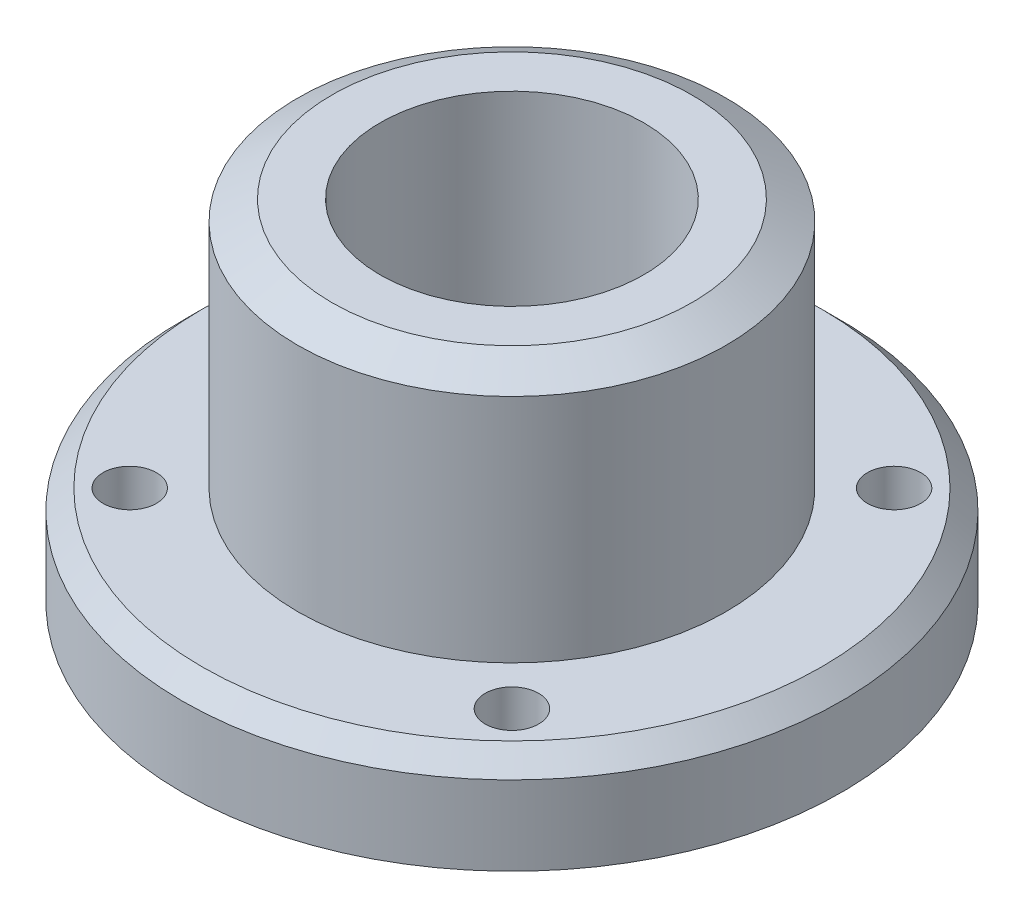
ISO-10303-21;
HEADER;
FILE_DESCRIPTION(('STEP AP214'),'2;1');
FILE_NAME('part.step','',(''),(''),'','','');
FILE_SCHEMA(('AUTOMOTIVE_DESIGN { 1 0 10303 214 1 1 1 1 }'));
ENDSEC;
DATA;
#1=APPLICATION_CONTEXT('core data for automotive mechanical design processes');
#2=APPLICATION_PROTOCOL_DEFINITION('international standard','automotive_design',2000,#1);
#3=PRODUCT_CONTEXT('',#1,'mechanical');
#4=PRODUCT('Part','Part','',(#3));
#5=PRODUCT_RELATED_PRODUCT_CATEGORY('part','',(#4));
#6=PRODUCT_DEFINITION_FORMATION('','',#4);
#7=PRODUCT_DEFINITION_CONTEXT('part definition',#1,'design');
#8=PRODUCT_DEFINITION('design','',#6,#7);
#9=PRODUCT_DEFINITION_SHAPE('','',#8);
#10=(LENGTH_UNIT() NAMED_UNIT(*) SI_UNIT(.MILLI.,.METRE.));
#11=(NAMED_UNIT(*) PLANE_ANGLE_UNIT() SI_UNIT($,.RADIAN.));
#12=(NAMED_UNIT(*) SI_UNIT($,.STERADIAN.) SOLID_ANGLE_UNIT());
#13=UNCERTAINTY_MEASURE_WITH_UNIT(LENGTH_MEASURE(1.E-05),#10,'distance_accuracy_value','');
#14=(GEOMETRIC_REPRESENTATION_CONTEXT(3) GLOBAL_UNCERTAINTY_ASSIGNED_CONTEXT((#13)) GLOBAL_UNIT_ASSIGNED_CONTEXT((#10,
#11,#12)) REPRESENTATION_CONTEXT('',''));
#15=CARTESIAN_POINT('',(0.,0.,0.));
#16=DIRECTION('',(0.,0.,1.));
#17=DIRECTION('',(1.,0.,0.));
#18=AXIS2_PLACEMENT_3D('',#15,#16,#17);
#19=CARTESIAN_POINT('',(0.,26.5,0.));
#20=DIRECTION('',(0.,-1.,0.));
#21=DIRECTION('',(0.,0.,-1.));
#22=AXIS2_PLACEMENT_3D('',#19,#20,#21);
#23=CYLINDRICAL_SURFACE('',#22,50.);
#24=CARTESIAN_POINT('',(0.,23.5,0.));
#25=DIRECTION('',(0.,1.,0.));
#26=DIRECTION('',(0.,0.,1.));
#27=AXIS2_PLACEMENT_3D('',#24,#25,#26);
#28=CIRCLE('',#27,50.);
#29=CARTESIAN_POINT('',(0.,23.5,50.));
#30=VERTEX_POINT('',#29);
#31=EDGE_CURVE('E51',#30,#30,#28,.F.);
#32=ORIENTED_EDGE('',*,*,#31,.T.);
#33=EDGE_LOOP('',(#32));
#34=FACE_BOUND('',#33,.T.);
#35=CARTESIAN_POINT('',(0.,11.5,0.));
#36=DIRECTION('',(0.,-1.,0.));
#37=DIRECTION('',(0.,0.,1.));
#38=AXIS2_PLACEMENT_3D('',#35,#36,#37);
#39=CIRCLE('',#38,50.);
#40=CARTESIAN_POINT('',(0.,11.5,50.));
#41=VERTEX_POINT('',#40);
#42=EDGE_CURVE('E59',#41,#41,#39,.T.);
#43=ORIENTED_EDGE('',*,*,#42,.F.);
#44=EDGE_LOOP('',(#43));
#45=FACE_BOUND('',#44,.T.);
#46=ADVANCED_FACE('F43',(#34,#45),#23,.T.);
#47=CARTESIAN_POINT('',(0.,26.5,0.));
#48=DIRECTION('',(0.,1.,0.));
#49=DIRECTION('',(0.,0.,1.));
#50=AXIS2_PLACEMENT_3D('',#47,#48,#49);
#51=PLANE('',#50);
#52=CARTESIAN_POINT('',(0.,26.5,0.));
#53=DIRECTION('',(0.,1.,0.));
#54=DIRECTION('',(0.,0.,1.));
#55=AXIS2_PLACEMENT_3D('',#52,#53,#54);
#56=CIRCLE('',#55,47.);
#57=CARTESIAN_POINT('',(0.,26.5,47.));
#58=VERTEX_POINT('',#57);
#59=EDGE_CURVE('E10',#58,#58,#56,.T.);
#60=ORIENTED_EDGE('',*,*,#59,.T.);
#61=EDGE_LOOP('',(#60));
#62=FACE_BOUND('',#61,.T.);
#63=CARTESIAN_POINT('',(-28.9913780286485,26.5,-28.9913780286485));
#64=DIRECTION('',(0.,1.,0.));
#65=DIRECTION('',(0.,0.,1.));
#66=AXIS2_PLACEMENT_3D('',#63,#64,#65);
#67=CIRCLE('',#66,4.05000000000002);
#68=CARTESIAN_POINT('',(-28.9913780286485,26.5,-24.9413780286485));
#69=VERTEX_POINT('',#68);
#70=EDGE_CURVE('E88',#69,#69,#67,.F.);
#71=ORIENTED_EDGE('',*,*,#70,.T.);
#72=EDGE_LOOP('',(#71));
#73=FACE_BOUND('',#72,.T.);
#74=CARTESIAN_POINT('',(-28.9913780286486,26.5,28.9913780286484));
#75=DIRECTION('',(0.,1.,0.));
#76=DIRECTION('',(0.,0.,1.));
#77=AXIS2_PLACEMENT_3D('',#74,#75,#76);
#78=CIRCLE('',#77,4.05000000000002);
#79=CARTESIAN_POINT('',(-28.9913780286486,26.5,33.0413780286485));
#80=VERTEX_POINT('',#79);
#81=EDGE_CURVE('E91',#80,#80,#78,.F.);
#82=ORIENTED_EDGE('',*,*,#81,.T.);
#83=EDGE_LOOP('',(#82));
#84=FACE_BOUND('',#83,.T.);
#85=CARTESIAN_POINT('',(28.9913780286487,26.5,28.9913780286483));
#86=DIRECTION('',(0.,1.,0.));
#87=DIRECTION('',(0.,0.,1.));
#88=AXIS2_PLACEMENT_3D('',#85,#86,#87);
#89=CIRCLE('',#88,4.05000000000002);
#90=CARTESIAN_POINT('',(28.9913780286487,26.5,33.0413780286483));
#91=VERTEX_POINT('',#90);
#92=EDGE_CURVE('E94',#91,#91,#89,.F.);
#93=ORIENTED_EDGE('',*,*,#92,.T.);
#94=EDGE_LOOP('',(#93));
#95=FACE_BOUND('',#94,.T.);
#96=CARTESIAN_POINT('',(28.9913780286486,26.5,-28.9913780286484));
#97=DIRECTION('',(0.,1.,0.));
#98=DIRECTION('',(0.,0.,1.));
#99=AXIS2_PLACEMENT_3D('',#96,#97,#98);
#100=CIRCLE('',#99,4.05000000000002);
#101=CARTESIAN_POINT('',(28.9913780286486,26.5,-24.9413780286484));
#102=VERTEX_POINT('',#101);
#103=EDGE_CURVE('E80',#102,#102,#100,.F.);
#104=ORIENTED_EDGE('',*,*,#103,.T.);
#105=EDGE_LOOP('',(#104));
#106=FACE_BOUND('',#105,.T.);
#107=CARTESIAN_POINT('',(0.,26.5,0.));
#108=DIRECTION('',(0.,1.,0.));
#109=DIRECTION('',(0.,0.,1.));
#110=AXIS2_PLACEMENT_3D('',#107,#108,#109);
#111=CIRCLE('',#110,32.5);
#112=CARTESIAN_POINT('',(0.,26.5,32.5));
#113=VERTEX_POINT('',#112);
#114=EDGE_CURVE('E55',#113,#113,#111,.T.);
#115=ORIENTED_EDGE('',*,*,#114,.F.);
#116=EDGE_LOOP('',(#115));
#117=FACE_BOUND('',#116,.T.);
#118=ADVANCED_FACE('F125',(#62,#73,#84,#95,#106,#117),#51,.T.);
#119=CARTESIAN_POINT('',(0.,11.5,0.));
#120=DIRECTION('',(0.,1.,0.));
#121=DIRECTION('',(0.,0.,1.));
#122=AXIS2_PLACEMENT_3D('',#119,#120,#121);
#123=PLANE('',#122);
#124=CARTESIAN_POINT('',(-28.9913780286485,11.5,-28.9913780286485));
#125=DIRECTION('',(0.,1.,0.));
#126=DIRECTION('',(1.,0.,0.));
#127=AXIS2_PLACEMENT_3D('',#124,#125,#126);
#128=CIRCLE('',#127,4.05000000000002);
#129=CARTESIAN_POINT('',(-24.9413780286485,11.5,-28.9913780286485));
#130=VERTEX_POINT('',#129);
#131=EDGE_CURVE('E97',#130,#130,#128,.T.);
#132=ORIENTED_EDGE('',*,*,#131,.T.);
#133=EDGE_LOOP('',(#132));
#134=FACE_BOUND('',#133,.T.);
#135=CARTESIAN_POINT('',(-28.9913780286486,11.5,28.9913780286484));
#136=DIRECTION('',(0.,1.,0.));
#137=DIRECTION('',(0.,0.,-1.));
#138=AXIS2_PLACEMENT_3D('',#135,#136,#137);
#139=CIRCLE('',#138,4.05000000000002);
#140=CARTESIAN_POINT('',(-28.9913780286486,11.5,24.9413780286484));
#141=VERTEX_POINT('',#140);
#142=EDGE_CURVE('E101',#141,#141,#139,.T.);
#143=ORIENTED_EDGE('',*,*,#142,.T.);
#144=EDGE_LOOP('',(#143));
#145=FACE_BOUND('',#144,.T.);
#146=CARTESIAN_POINT('',(28.9913780286487,11.5,28.9913780286483));
#147=DIRECTION('',(0.,1.,0.));
#148=DIRECTION('',(-1.,0.,0.));
#149=AXIS2_PLACEMENT_3D('',#146,#147,#148);
#150=CIRCLE('',#149,4.05000000000002);
#151=CARTESIAN_POINT('',(24.9413780286487,11.5,28.9913780286483));
#152=VERTEX_POINT('',#151);
#153=EDGE_CURVE('E98',#152,#152,#150,.T.);
#154=ORIENTED_EDGE('',*,*,#153,.T.);
#155=EDGE_LOOP('',(#154));
#156=FACE_BOUND('',#155,.T.);
#157=CARTESIAN_POINT('',(28.9913780286486,11.5,-28.9913780286484));
#158=DIRECTION('',(0.,1.,0.));
#159=DIRECTION('',(0.,0.,1.));
#160=AXIS2_PLACEMENT_3D('',#157,#158,#159);
#161=CIRCLE('',#160,4.05000000000002);
#162=CARTESIAN_POINT('',(28.9913780286486,11.5,-24.9413780286484));
#163=VERTEX_POINT('',#162);
#164=EDGE_CURVE('E85',#163,#163,#161,.T.);
#165=ORIENTED_EDGE('',*,*,#164,.T.);
#166=EDGE_LOOP('',(#165));
#167=FACE_BOUND('',#166,.T.);
#168=CARTESIAN_POINT('',(0.,11.5,0.));
#169=DIRECTION('',(0.,-1.,0.));
#170=DIRECTION('',(0.,0.,1.));
#171=AXIS2_PLACEMENT_3D('',#168,#169,#170);
#172=CIRCLE('',#171,25.75);
#173=CARTESIAN_POINT('',(0.,11.5,25.75));
#174=VERTEX_POINT('',#173);
#175=EDGE_CURVE('E71',#174,#174,#172,.T.);
#176=ORIENTED_EDGE('',*,*,#175,.F.);
#177=EDGE_LOOP('',(#176));
#178=FACE_BOUND('',#177,.T.);
#179=ORIENTED_EDGE('',*,*,#42,.T.);
#180=EDGE_LOOP('',(#179));
#181=FACE_BOUND('',#180,.T.);
#182=ADVANCED_FACE('F107',(#134,#145,#156,#167,#178,#181),#123,.F.);
#183=CARTESIAN_POINT('',(0.,61.5,0.));
#184=DIRECTION('',(0.,-1.,0.));
#185=DIRECTION('',(0.,0.,-1.));
#186=AXIS2_PLACEMENT_3D('',#183,#184,#185);
#187=CYLINDRICAL_SURFACE('',#186,32.5);
#188=CARTESIAN_POINT('',(0.,61.5,0.));
#189=DIRECTION('',(0.,1.,0.));
#190=DIRECTION('',(0.,0.,1.));
#191=AXIS2_PLACEMENT_3D('',#188,#189,#190);
#192=CIRCLE('',#191,32.5);
#193=CARTESIAN_POINT('',(0.,61.5,32.5));
#194=VERTEX_POINT('',#193);
#195=EDGE_CURVE('E63',#194,#194,#192,.T.);
#196=ORIENTED_EDGE('',*,*,#195,.F.);
#197=EDGE_LOOP('',(#196));
#198=FACE_BOUND('',#197,.T.);
#199=ORIENTED_EDGE('',*,*,#114,.T.);
#200=EDGE_LOOP('',(#199));
#201=FACE_BOUND('',#200,.T.);
#202=ADVANCED_FACE('F133',(#198,#201),#187,.T.);
#203=CARTESIAN_POINT('',(0.,61.5,0.));
#204=DIRECTION('',(0.,-1.,0.));
#205=DIRECTION('',(0.,0.,1.));
#206=AXIS2_PLACEMENT_3D('',#203,#204,#205);
#207=CONICAL_SURFACE('',#206,32.5,1.0471975511966);
#208=CARTESIAN_POINT('',(0.,64.5,0.));
#209=DIRECTION('',(0.,1.,0.));
#210=DIRECTION('',(0.,0.,1.));
#211=AXIS2_PLACEMENT_3D('',#208,#209,#210);
#212=CIRCLE('',#211,27.3038475772933);
#213=CARTESIAN_POINT('',(0.,64.5,27.3038475772933));
#214=VERTEX_POINT('',#213);
#215=EDGE_CURVE('E67',#214,#214,#212,.T.);
#216=ORIENTED_EDGE('',*,*,#215,.F.);
#217=EDGE_LOOP('',(#216));
#218=FACE_BOUND('',#217,.T.);
#219=ORIENTED_EDGE('',*,*,#195,.T.);
#220=EDGE_LOOP('',(#219));
#221=FACE_BOUND('',#220,.T.);
#222=ADVANCED_FACE('F137',(#218,#221),#207,.T.);
#223=CARTESIAN_POINT('',(0.,64.5,0.));
#224=DIRECTION('',(0.,1.,0.));
#225=DIRECTION('',(0.,0.,1.));
#226=AXIS2_PLACEMENT_3D('',#223,#224,#225);
#227=PLANE('',#226);
#228=CARTESIAN_POINT('',(0.,64.5,0.));
#229=DIRECTION('',(0.,-1.,0.));
#230=DIRECTION('',(0.,0.,1.));
#231=AXIS2_PLACEMENT_3D('',#228,#229,#230);
#232=CIRCLE('',#231,20.);
#233=CARTESIAN_POINT('',(0.,64.5,20.));
#234=VERTEX_POINT('',#233);
#235=EDGE_CURVE('E74',#234,#234,#232,.T.);
#236=ORIENTED_EDGE('',*,*,#235,.T.);
#237=EDGE_LOOP('',(#236));
#238=FACE_BOUND('',#237,.T.);
#239=ORIENTED_EDGE('',*,*,#215,.T.);
#240=EDGE_LOOP('',(#239));
#241=FACE_BOUND('',#240,.T.);
#242=ADVANCED_FACE('F141',(#238,#241),#227,.T.);
#243=CARTESIAN_POINT('',(0.,21.7,0.));
#244=DIRECTION('',(0.,-1.,0.));
#245=DIRECTION('',(0.,0.,-1.));
#246=AXIS2_PLACEMENT_3D('',#243,#244,#245);
#247=CYLINDRICAL_SURFACE('',#246,25.75);
#248=CARTESIAN_POINT('',(0.,21.7,0.));
#249=DIRECTION('',(0.,-1.,0.));
#250=DIRECTION('',(0.,0.,1.));
#251=AXIS2_PLACEMENT_3D('',#248,#249,#250);
#252=CIRCLE('',#251,25.75);
#253=CARTESIAN_POINT('',(0.,21.7,25.75));
#254=VERTEX_POINT('',#253);
#255=EDGE_CURVE('E70',#254,#254,#252,.T.);
#256=ORIENTED_EDGE('',*,*,#255,.F.);
#257=EDGE_LOOP('',(#256));
#258=FACE_BOUND('',#257,.T.);
#259=ORIENTED_EDGE('',*,*,#175,.T.);
#260=EDGE_LOOP('',(#259));
#261=FACE_BOUND('',#260,.T.);
#262=ADVANCED_FACE('F145',(#258,#261),#247,.F.);
#263=CARTESIAN_POINT('',(0.,21.7,0.));
#264=DIRECTION('',(0.,1.,0.));
#265=DIRECTION('',(0.,0.,1.));
#266=AXIS2_PLACEMENT_3D('',#263,#264,#265);
#267=PLANE('',#266);
#268=CARTESIAN_POINT('',(0.,21.7,0.));
#269=DIRECTION('',(0.,-1.,0.));
#270=DIRECTION('',(0.,0.,1.));
#271=AXIS2_PLACEMENT_3D('',#268,#269,#270);
#272=CIRCLE('',#271,20.);
#273=CARTESIAN_POINT('',(0.,21.7,20.));
#274=VERTEX_POINT('',#273);
#275=EDGE_CURVE('E77',#274,#274,#272,.T.);
#276=ORIENTED_EDGE('',*,*,#275,.F.);
#277=EDGE_LOOP('',(#276));
#278=FACE_BOUND('',#277,.T.);
#279=ORIENTED_EDGE('',*,*,#255,.T.);
#280=EDGE_LOOP('',(#279));
#281=FACE_BOUND('',#280,.T.);
#282=ADVANCED_FACE('F149',(#278,#281),#267,.F.);
#283=CARTESIAN_POINT('',(0.,64.5,0.));
#284=DIRECTION('',(0.,-1.,0.));
#285=DIRECTION('',(0.,0.,-1.));
#286=AXIS2_PLACEMENT_3D('',#283,#284,#285);
#287=CYLINDRICAL_SURFACE('',#286,20.);
#288=ORIENTED_EDGE('',*,*,#235,.F.);
#289=EDGE_LOOP('',(#288));
#290=FACE_BOUND('',#289,.T.);
#291=ORIENTED_EDGE('',*,*,#275,.T.);
#292=EDGE_LOOP('',(#291));
#293=FACE_BOUND('',#292,.T.);
#294=ADVANCED_FACE('F153',(#290,#293),#287,.F.);
#295=CARTESIAN_POINT('',(28.9913780286486,51.5,-28.9913780286484));
#296=DIRECTION('',(0.,-1.,0.));
#297=DIRECTION('',(0.,0.,-1.));
#298=AXIS2_PLACEMENT_3D('',#295,#296,#297);
#299=CYLINDRICAL_SURFACE('',#298,4.05000000000002);
#300=ORIENTED_EDGE('',*,*,#103,.F.);
#301=EDGE_LOOP('',(#300));
#302=FACE_BOUND('',#301,.T.);
#303=ORIENTED_EDGE('',*,*,#164,.F.);
#304=EDGE_LOOP('',(#303));
#305=FACE_BOUND('',#304,.T.);
#306=ADVANCED_FACE('F157',(#302,#305),#299,.F.);
#307=CARTESIAN_POINT('',(28.9913780286487,51.5,28.9913780286483));
#308=DIRECTION('',(0.,-1.,0.));
#309=DIRECTION('',(0.,0.,-1.));
#310=AXIS2_PLACEMENT_3D('',#307,#308,#309);
#311=CYLINDRICAL_SURFACE('',#310,4.05000000000002);
#312=ORIENTED_EDGE('',*,*,#92,.F.);
#313=EDGE_LOOP('',(#312));
#314=FACE_BOUND('',#313,.T.);
#315=ORIENTED_EDGE('',*,*,#153,.F.);
#316=EDGE_LOOP('',(#315));
#317=FACE_BOUND('',#316,.T.);
#318=ADVANCED_FACE('F121',(#314,#317),#311,.F.);
#319=CARTESIAN_POINT('',(-28.9913780286486,51.5,28.9913780286484));
#320=DIRECTION('',(0.,-1.,0.));
#321=DIRECTION('',(0.,0.,-1.));
#322=AXIS2_PLACEMENT_3D('',#319,#320,#321);
#323=CYLINDRICAL_SURFACE('',#322,4.05000000000002);
#324=ORIENTED_EDGE('',*,*,#81,.F.);
#325=EDGE_LOOP('',(#324));
#326=FACE_BOUND('',#325,.T.);
#327=ORIENTED_EDGE('',*,*,#142,.F.);
#328=EDGE_LOOP('',(#327));
#329=FACE_BOUND('',#328,.T.);
#330=ADVANCED_FACE('F112',(#326,#329),#323,.F.);
#331=CARTESIAN_POINT('',(-28.9913780286485,51.5,-28.9913780286485));
#332=DIRECTION('',(0.,-1.,0.));
#333=DIRECTION('',(0.,0.,-1.));
#334=AXIS2_PLACEMENT_3D('',#331,#332,#333);
#335=CYLINDRICAL_SURFACE('',#334,4.05000000000002);
#336=ORIENTED_EDGE('',*,*,#70,.F.);
#337=EDGE_LOOP('',(#336));
#338=FACE_BOUND('',#337,.T.);
#339=ORIENTED_EDGE('',*,*,#131,.F.);
#340=EDGE_LOOP('',(#339));
#341=FACE_BOUND('',#340,.T.);
#342=ADVANCED_FACE('F110',(#338,#341),#335,.F.);
#343=CARTESIAN_POINT('',(0.,23.5,0.));
#344=DIRECTION('',(0.,-1.,0.));
#345=DIRECTION('',(0.,0.,-1.));
#346=AXIS2_PLACEMENT_3D('',#343,#344,#345);
#347=CONICAL_SURFACE('',#346,50.,0.785398163397451);
#348=ORIENTED_EDGE('',*,*,#59,.F.);
#349=EDGE_LOOP('',(#348));
#350=FACE_BOUND('',#349,.T.);
#351=ORIENTED_EDGE('',*,*,#31,.F.);
#352=EDGE_LOOP('',(#351));
#353=FACE_BOUND('',#352,.T.);
#354=ADVANCED_FACE('F46',(#350,#353),#347,.T.);
#355=CLOSED_SHELL('',(#46,#118,#182,#202,#222,#242,#262,#282,#294,#306,#318,#330,#342,#354));
#356=MANIFOLD_SOLID_BREP('B2',#355);
#357=ADVANCED_BREP_SHAPE_REPRESENTATION('',(#18,#356),#14);
#358=SHAPE_DEFINITION_REPRESENTATION(#9,#357);
ENDSEC;
END-ISO-10303-21;
